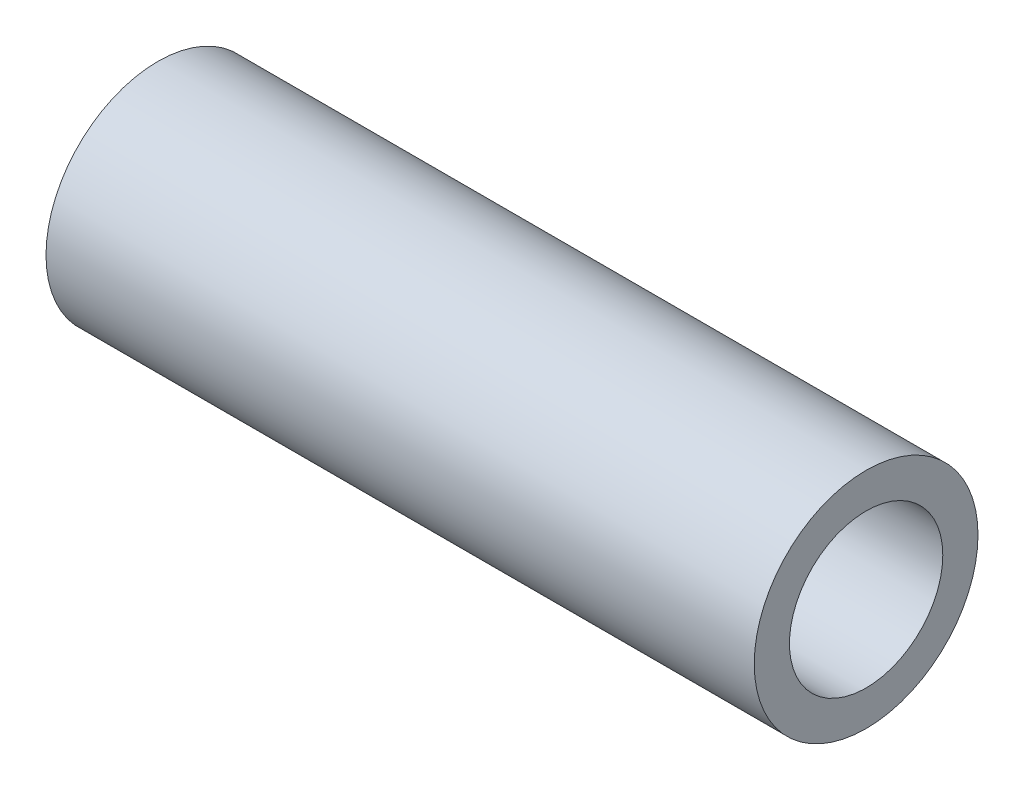
ISO-10303-21;
HEADER;
FILE_DESCRIPTION(('STEP AP214'),'2;1');
FILE_NAME('part.step','',(''),(''),'','','');
FILE_SCHEMA(('AUTOMOTIVE_DESIGN { 1 0 10303 214 1 1 1 1 }'));
ENDSEC;
DATA;
#1=APPLICATION_CONTEXT('core data for automotive mechanical design processes');
#2=APPLICATION_PROTOCOL_DEFINITION('international standard','automotive_design',2000,#1);
#3=PRODUCT_CONTEXT('',#1,'mechanical');
#4=PRODUCT('Part','Part','',(#3));
#5=PRODUCT_RELATED_PRODUCT_CATEGORY('part','',(#4));
#6=PRODUCT_DEFINITION_FORMATION('','',#4);
#7=PRODUCT_DEFINITION_CONTEXT('part definition',#1,'design');
#8=PRODUCT_DEFINITION('design','',#6,#7);
#9=PRODUCT_DEFINITION_SHAPE('','',#8);
#10=(LENGTH_UNIT() NAMED_UNIT(*) SI_UNIT(.MILLI.,.METRE.));
#11=(NAMED_UNIT(*) PLANE_ANGLE_UNIT() SI_UNIT($,.RADIAN.));
#12=(NAMED_UNIT(*) SI_UNIT($,.STERADIAN.) SOLID_ANGLE_UNIT());
#13=UNCERTAINTY_MEASURE_WITH_UNIT(LENGTH_MEASURE(1.E-05),#10,'distance_accuracy_value','');
#14=(GEOMETRIC_REPRESENTATION_CONTEXT(3) GLOBAL_UNCERTAINTY_ASSIGNED_CONTEXT((#13)) GLOBAL_UNIT_ASSIGNED_CONTEXT((#10,
#11,#12)) REPRESENTATION_CONTEXT('',''));
#15=CARTESIAN_POINT('',(0.,0.,0.));
#16=DIRECTION('',(0.,0.,1.));
#17=DIRECTION('',(1.,0.,0.));
#18=AXIS2_PLACEMENT_3D('',#15,#16,#17);
#19=CARTESIAN_POINT('',(30.1498,0.,0.));
#20=DIRECTION('',(1.,0.,0.));
#21=DIRECTION('',(0.,0.,-1.));
#22=AXIS2_PLACEMENT_3D('',#19,#20,#21);
#23=PLANE('',#22);
#24=CARTESIAN_POINT('',(30.1498,0.,0.));
#25=DIRECTION('',(1.,0.,0.));
#26=DIRECTION('',(0.,0.,-1.));
#27=AXIS2_PLACEMENT_3D('',#24,#25,#26);
#28=CIRCLE('',#27,4.7625);
#29=CARTESIAN_POINT('',(30.1498,0.,-4.7625));
#30=VERTEX_POINT('',#29);
#31=EDGE_CURVE('E10',#30,#30,#28,.T.);
#32=ORIENTED_EDGE('',*,*,#31,.T.);
#33=EDGE_LOOP('',(#32));
#34=FACE_BOUND('',#33,.T.);
#35=CARTESIAN_POINT('',(30.1498,0.,0.));
#36=DIRECTION('',(1.,0.,0.));
#37=DIRECTION('',(0.,0.,-1.));
#38=AXIS2_PLACEMENT_3D('',#35,#36,#37);
#39=CIRCLE('',#38,3.2639);
#40=CARTESIAN_POINT('',(30.1498,0.,-3.2639));
#41=VERTEX_POINT('',#40);
#42=EDGE_CURVE('E42',#41,#41,#39,.T.);
#43=ORIENTED_EDGE('',*,*,#42,.F.);
#44=EDGE_LOOP('',(#43));
#45=FACE_BOUND('',#44,.T.);
#46=ADVANCED_FACE('F31',(#34,#45),#23,.T.);
#47=CARTESIAN_POINT('',(0.,0.,0.));
#48=DIRECTION('',(1.,0.,0.));
#49=DIRECTION('',(0.,0.,-1.));
#50=AXIS2_PLACEMENT_3D('',#47,#48,#49);
#51=PLANE('',#50);
#52=CARTESIAN_POINT('',(0.,0.,0.));
#53=DIRECTION('',(1.,0.,0.));
#54=DIRECTION('',(0.,0.,-1.));
#55=AXIS2_PLACEMENT_3D('',#52,#53,#54);
#56=CIRCLE('',#55,4.7625);
#57=CARTESIAN_POINT('',(0.,0.,-4.7625));
#58=VERTEX_POINT('',#57);
#59=EDGE_CURVE('E35',#58,#58,#56,.T.);
#60=ORIENTED_EDGE('',*,*,#59,.F.);
#61=EDGE_LOOP('',(#60));
#62=FACE_BOUND('',#61,.T.);
#63=CARTESIAN_POINT('',(0.,0.,0.));
#64=DIRECTION('',(1.,0.,0.));
#65=DIRECTION('',(0.,0.,-1.));
#66=AXIS2_PLACEMENT_3D('',#63,#64,#65);
#67=CIRCLE('',#66,3.2639);
#68=CARTESIAN_POINT('',(0.,0.,-3.2639));
#69=VERTEX_POINT('',#68);
#70=EDGE_CURVE('E44',#69,#69,#67,.T.);
#71=ORIENTED_EDGE('',*,*,#70,.T.);
#72=EDGE_LOOP('',(#71));
#73=FACE_BOUND('',#72,.T.);
#74=ADVANCED_FACE('F54',(#62,#73),#51,.F.);
#75=CARTESIAN_POINT('',(30.1498,0.,0.));
#76=DIRECTION('',(-1.,0.,0.));
#77=DIRECTION('',(0.,0.,1.));
#78=AXIS2_PLACEMENT_3D('',#75,#76,#77);
#79=CYLINDRICAL_SURFACE('',#78,4.7625);
#80=ORIENTED_EDGE('',*,*,#31,.F.);
#81=EDGE_LOOP('',(#80));
#82=FACE_BOUND('',#81,.T.);
#83=ORIENTED_EDGE('',*,*,#59,.T.);
#84=EDGE_LOOP('',(#83));
#85=FACE_BOUND('',#84,.T.);
#86=ADVANCED_FACE('F33',(#82,#85),#79,.T.);
#87=CARTESIAN_POINT('',(30.1498,0.,0.));
#88=DIRECTION('',(-1.,0.,0.));
#89=DIRECTION('',(0.,0.,1.));
#90=AXIS2_PLACEMENT_3D('',#87,#88,#89);
#91=CYLINDRICAL_SURFACE('',#90,3.2639);
#92=ORIENTED_EDGE('',*,*,#42,.T.);
#93=EDGE_LOOP('',(#92));
#94=FACE_BOUND('',#93,.T.);
#95=ORIENTED_EDGE('',*,*,#70,.F.);
#96=EDGE_LOOP('',(#95));
#97=FACE_BOUND('',#96,.T.);
#98=ADVANCED_FACE('F50',(#94,#97),#91,.F.);
#99=CLOSED_SHELL('',(#46,#74,#86,#98));
#100=MANIFOLD_SOLID_BREP('B2',#99);
#101=ADVANCED_BREP_SHAPE_REPRESENTATION('',(#18,#100),#14);
#102=SHAPE_DEFINITION_REPRESENTATION(#9,#101);
ENDSEC;
END-ISO-10303-21;
